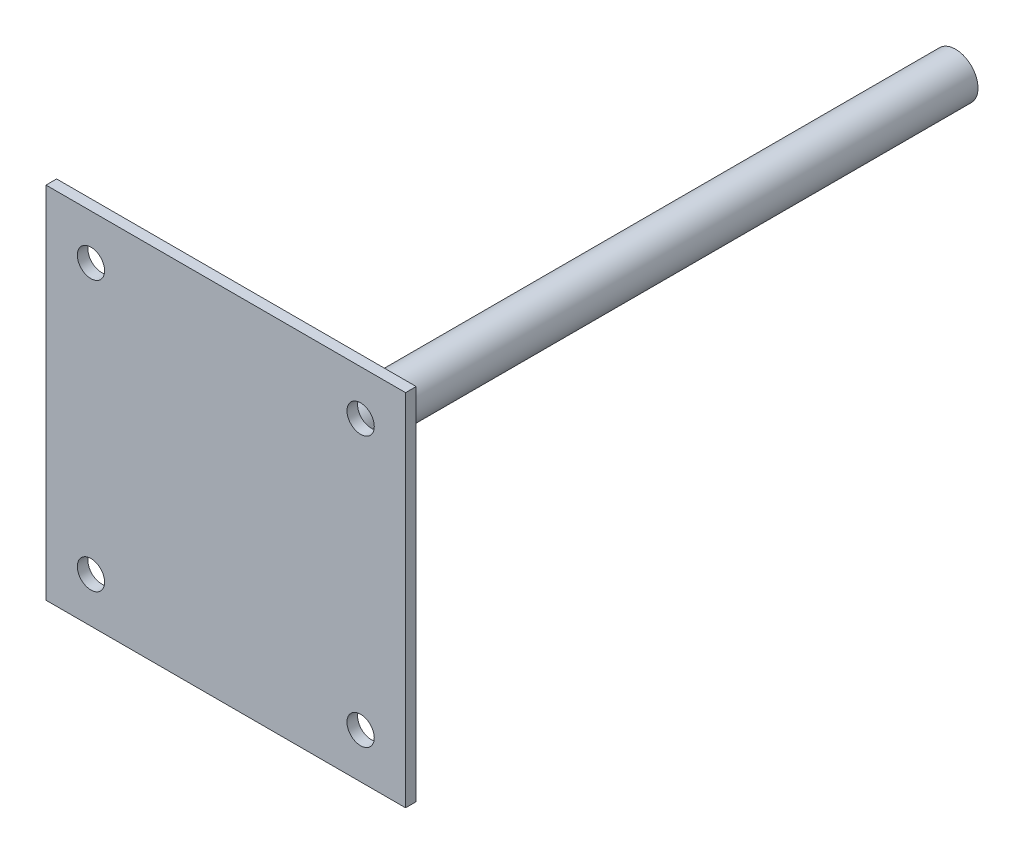
ISO-10303-21;
HEADER;
FILE_DESCRIPTION(('STEP AP214'),'2;1');
FILE_NAME('part.step','',(''),(''),'','','');
FILE_SCHEMA(('AUTOMOTIVE_DESIGN { 1 0 10303 214 1 1 1 1 }'));
ENDSEC;
DATA;
#1=APPLICATION_CONTEXT('core data for automotive mechanical design processes');
#2=APPLICATION_PROTOCOL_DEFINITION('international standard','automotive_design',2000,#1);
#3=PRODUCT_CONTEXT('',#1,'mechanical');
#4=PRODUCT('Part','Part','',(#3));
#5=PRODUCT_RELATED_PRODUCT_CATEGORY('part','',(#4));
#6=PRODUCT_DEFINITION_FORMATION('','',#4);
#7=PRODUCT_DEFINITION_CONTEXT('part definition',#1,'design');
#8=PRODUCT_DEFINITION('design','',#6,#7);
#9=PRODUCT_DEFINITION_SHAPE('','',#8);
#10=(LENGTH_UNIT() NAMED_UNIT(*) SI_UNIT(.MILLI.,.METRE.));
#11=(NAMED_UNIT(*) PLANE_ANGLE_UNIT() SI_UNIT($,.RADIAN.));
#12=(NAMED_UNIT(*) SI_UNIT($,.STERADIAN.) SOLID_ANGLE_UNIT());
#13=UNCERTAINTY_MEASURE_WITH_UNIT(LENGTH_MEASURE(1.E-05),#10,'distance_accuracy_value','');
#14=(GEOMETRIC_REPRESENTATION_CONTEXT(3) GLOBAL_UNCERTAINTY_ASSIGNED_CONTEXT((#13)) GLOBAL_UNIT_ASSIGNED_CONTEXT((#10,
#11,#12)) REPRESENTATION_CONTEXT('',''));
#15=CARTESIAN_POINT('',(0.,0.,0.));
#16=DIRECTION('',(0.,0.,1.));
#17=DIRECTION('',(1.,0.,0.));
#18=AXIS2_PLACEMENT_3D('',#15,#16,#17);
#19=CARTESIAN_POINT('',(50.8,0.,3.));
#20=DIRECTION('',(1.,0.,0.));
#21=DIRECTION('',(0.,0.,-1.));
#22=AXIS2_PLACEMENT_3D('',#19,#20,#21);
#23=PLANE('',#22);
#24=DIRECTION('',(0.,-1.,0.));
#25=VECTOR('',#24,1.);
#26=CARTESIAN_POINT('',(50.8,0.,0.));
#27=LINE('',#26,#25);
#28=CARTESIAN_POINT('',(50.8,50.8,0.));
#29=VERTEX_POINT('',#28);
#30=CARTESIAN_POINT('',(50.8,-50.8,0.));
#31=VERTEX_POINT('',#30);
#32=EDGE_CURVE('E135',#29,#31,#27,.T.);
#33=ORIENTED_EDGE('',*,*,#32,.F.);
#34=DIRECTION('',(0.,0.,-1.));
#35=VECTOR('',#34,1.);
#36=CARTESIAN_POINT('',(50.8,50.8,3.));
#37=LINE('',#36,#35);
#38=CARTESIAN_POINT('',(50.8,50.8,3.));
#39=VERTEX_POINT('',#38);
#40=EDGE_CURVE('E11',#39,#29,#37,.T.);
#41=ORIENTED_EDGE('',*,*,#40,.F.);
#42=DIRECTION('',(0.,-1.,0.));
#43=VECTOR('',#42,1.);
#44=CARTESIAN_POINT('',(50.8,0.,3.));
#45=LINE('',#44,#43);
#46=CARTESIAN_POINT('',(50.8,-50.8,3.));
#47=VERTEX_POINT('',#46);
#48=EDGE_CURVE('E108',#39,#47,#45,.T.);
#49=ORIENTED_EDGE('',*,*,#48,.T.);
#50=DIRECTION('',(0.,0.,-1.));
#51=VECTOR('',#50,1.);
#52=CARTESIAN_POINT('',(50.8,-50.8,3.));
#53=LINE('',#52,#51);
#54=EDGE_CURVE('E84',#47,#31,#53,.T.);
#55=ORIENTED_EDGE('',*,*,#54,.T.);
#56=EDGE_LOOP('',(#33,#41,#49,#55));
#57=FACE_BOUND('',#56,.T.);
#58=ADVANCED_FACE('F43',(#57),#23,.T.);
#59=CARTESIAN_POINT('',(0.,50.8,3.));
#60=DIRECTION('',(0.,1.,0.));
#61=DIRECTION('',(0.,0.,1.));
#62=AXIS2_PLACEMENT_3D('',#59,#60,#61);
#63=PLANE('',#62);
#64=DIRECTION('',(1.,0.,0.));
#65=VECTOR('',#64,1.);
#66=CARTESIAN_POINT('',(0.,50.8,0.));
#67=LINE('',#66,#65);
#68=CARTESIAN_POINT('',(-50.8,50.8,0.));
#69=VERTEX_POINT('',#68);
#70=EDGE_CURVE('E96',#69,#29,#67,.T.);
#71=ORIENTED_EDGE('',*,*,#70,.F.);
#72=DIRECTION('',(0.,0.,-1.));
#73=VECTOR('',#72,1.);
#74=CARTESIAN_POINT('',(-50.8,50.8,3.));
#75=LINE('',#74,#73);
#76=CARTESIAN_POINT('',(-50.8,50.8,3.));
#77=VERTEX_POINT('',#76);
#78=EDGE_CURVE('E53',#77,#69,#75,.T.);
#79=ORIENTED_EDGE('',*,*,#78,.F.);
#80=DIRECTION('',(1.,0.,0.));
#81=VECTOR('',#80,1.);
#82=CARTESIAN_POINT('',(0.,50.8,3.));
#83=LINE('',#82,#81);
#84=EDGE_CURVE('E94',#77,#39,#83,.T.);
#85=ORIENTED_EDGE('',*,*,#84,.T.);
#86=ORIENTED_EDGE('',*,*,#40,.T.);
#87=EDGE_LOOP('',(#71,#79,#85,#86));
#88=FACE_BOUND('',#87,.T.);
#89=ADVANCED_FACE('F92',(#88),#63,.T.);
#90=CARTESIAN_POINT('',(-50.8,0.,3.));
#91=DIRECTION('',(1.,0.,0.));
#92=DIRECTION('',(0.,0.,-1.));
#93=AXIS2_PLACEMENT_3D('',#90,#91,#92);
#94=PLANE('',#93);
#95=DIRECTION('',(0.,-1.,0.));
#96=VECTOR('',#95,1.);
#97=CARTESIAN_POINT('',(-50.8,0.,0.));
#98=LINE('',#97,#96);
#99=CARTESIAN_POINT('',(-50.8,-50.8,0.));
#100=VERTEX_POINT('',#99);
#101=EDGE_CURVE('E140',#69,#100,#98,.T.);
#102=ORIENTED_EDGE('',*,*,#101,.T.);
#103=DIRECTION('',(0.,0.,-1.));
#104=VECTOR('',#103,1.);
#105=CARTESIAN_POINT('',(-50.8,-50.8,3.));
#106=LINE('',#105,#104);
#107=CARTESIAN_POINT('',(-50.8,-50.8,3.));
#108=VERTEX_POINT('',#107);
#109=EDGE_CURVE('E100',#108,#100,#106,.T.);
#110=ORIENTED_EDGE('',*,*,#109,.F.);
#111=DIRECTION('',(0.,-1.,0.));
#112=VECTOR('',#111,1.);
#113=CARTESIAN_POINT('',(-50.8,0.,3.));
#114=LINE('',#113,#112);
#115=EDGE_CURVE('E102',#77,#108,#114,.T.);
#116=ORIENTED_EDGE('',*,*,#115,.F.);
#117=ORIENTED_EDGE('',*,*,#78,.T.);
#118=EDGE_LOOP('',(#102,#110,#116,#117));
#119=FACE_BOUND('',#118,.T.);
#120=ADVANCED_FACE('F103',(#119),#94,.F.);
#121=CARTESIAN_POINT('',(38.1,-38.1,3.));
#122=DIRECTION('',(0.,0.,-1.));
#123=DIRECTION('',(-1.,0.,0.));
#124=AXIS2_PLACEMENT_3D('',#121,#122,#123);
#125=CYLINDRICAL_SURFACE('',#124,3.85643376549096);
#126=CARTESIAN_POINT('',(38.1,-38.1,3.));
#127=DIRECTION('',(0.,0.,1.));
#128=DIRECTION('',(1.,0.,0.));
#129=AXIS2_PLACEMENT_3D('',#126,#127,#128);
#130=CIRCLE('',#129,3.85643376549096);
#131=CARTESIAN_POINT('',(41.9564337654909,-38.1,3.));
#132=VERTEX_POINT('',#131);
#133=EDGE_CURVE('E118',#132,#132,#130,.T.);
#134=ORIENTED_EDGE('',*,*,#133,.T.);
#135=EDGE_LOOP('',(#134));
#136=FACE_BOUND('',#135,.T.);
#137=CARTESIAN_POINT('',(38.1,-38.1,0.));
#138=DIRECTION('',(0.,0.,1.));
#139=DIRECTION('',(1.,0.,0.));
#140=AXIS2_PLACEMENT_3D('',#137,#138,#139);
#141=CIRCLE('',#140,3.85643376549096);
#142=CARTESIAN_POINT('',(41.9564337654909,-38.1,0.));
#143=VERTEX_POINT('',#142);
#144=EDGE_CURVE('E145',#143,#143,#141,.T.);
#145=ORIENTED_EDGE('',*,*,#144,.F.);
#146=EDGE_LOOP('',(#145));
#147=FACE_BOUND('',#146,.T.);
#148=ADVANCED_FACE('F177',(#136,#147),#125,.F.);
#149=CARTESIAN_POINT('',(0.,-50.8,3.));
#150=DIRECTION('',(0.,1.,0.));
#151=DIRECTION('',(0.,0.,1.));
#152=AXIS2_PLACEMENT_3D('',#149,#150,#151);
#153=PLANE('',#152);
#154=DIRECTION('',(1.,0.,0.));
#155=VECTOR('',#154,1.);
#156=CARTESIAN_POINT('',(0.,-50.8,0.));
#157=LINE('',#156,#155);
#158=EDGE_CURVE('E77',#100,#31,#157,.T.);
#159=ORIENTED_EDGE('',*,*,#158,.T.);
#160=ORIENTED_EDGE('',*,*,#54,.F.);
#161=DIRECTION('',(1.,0.,0.));
#162=VECTOR('',#161,1.);
#163=CARTESIAN_POINT('',(0.,-50.8,3.));
#164=LINE('',#163,#162);
#165=EDGE_CURVE('E61',#108,#47,#164,.T.);
#166=ORIENTED_EDGE('',*,*,#165,.F.);
#167=ORIENTED_EDGE('',*,*,#109,.T.);
#168=EDGE_LOOP('',(#159,#160,#166,#167));
#169=FACE_BOUND('',#168,.T.);
#170=ADVANCED_FACE('F158',(#169),#153,.F.);
#171=CARTESIAN_POINT('',(-38.1,38.1,3.));
#172=DIRECTION('',(0.,0.,-1.));
#173=DIRECTION('',(-1.,0.,0.));
#174=AXIS2_PLACEMENT_3D('',#171,#172,#173);
#175=CYLINDRICAL_SURFACE('',#174,3.85643376549096);
#176=CARTESIAN_POINT('',(-38.1,38.1,3.));
#177=DIRECTION('',(0.,0.,1.));
#178=DIRECTION('',(1.,0.,0.));
#179=AXIS2_PLACEMENT_3D('',#176,#177,#178);
#180=CIRCLE('',#179,3.85643376549096);
#181=CARTESIAN_POINT('',(-34.243566234509,38.1,3.));
#182=VERTEX_POINT('',#181);
#183=EDGE_CURVE('E112',#182,#182,#180,.T.);
#184=ORIENTED_EDGE('',*,*,#183,.T.);
#185=EDGE_LOOP('',(#184));
#186=FACE_BOUND('',#185,.T.);
#187=CARTESIAN_POINT('',(-38.1,38.1,0.));
#188=DIRECTION('',(0.,0.,1.));
#189=DIRECTION('',(1.,0.,0.));
#190=AXIS2_PLACEMENT_3D('',#187,#188,#189);
#191=CIRCLE('',#190,3.85643376549096);
#192=CARTESIAN_POINT('',(-34.243566234509,38.1,0.));
#193=VERTEX_POINT('',#192);
#194=EDGE_CURVE('E130',#193,#193,#191,.T.);
#195=ORIENTED_EDGE('',*,*,#194,.F.);
#196=EDGE_LOOP('',(#195));
#197=FACE_BOUND('',#196,.T.);
#198=ADVANCED_FACE('F168',(#186,#197),#175,.F.);
#199=CARTESIAN_POINT('',(38.1,38.1,3.));
#200=DIRECTION('',(0.,0.,-1.));
#201=DIRECTION('',(-1.,0.,0.));
#202=AXIS2_PLACEMENT_3D('',#199,#200,#201);
#203=CYLINDRICAL_SURFACE('',#202,3.85643376549096);
#204=CARTESIAN_POINT('',(38.1,38.1,3.));
#205=DIRECTION('',(0.,0.,1.));
#206=DIRECTION('',(1.,0.,0.));
#207=AXIS2_PLACEMENT_3D('',#204,#205,#206);
#208=CIRCLE('',#207,3.85643376549096);
#209=CARTESIAN_POINT('',(41.9564337654909,38.1,3.));
#210=VERTEX_POINT('',#209);
#211=EDGE_CURVE('E153',#210,#210,#208,.F.);
#212=ORIENTED_EDGE('',*,*,#211,.F.);
#213=EDGE_LOOP('',(#212));
#214=FACE_BOUND('',#213,.T.);
#215=CARTESIAN_POINT('',(38.1,38.1,0.));
#216=DIRECTION('',(0.,0.,1.));
#217=DIRECTION('',(1.,0.,0.));
#218=AXIS2_PLACEMENT_3D('',#215,#216,#217);
#219=CIRCLE('',#218,3.85643376549096);
#220=CARTESIAN_POINT('',(41.9564337654909,38.1,0.));
#221=VERTEX_POINT('',#220);
#222=EDGE_CURVE('E126',#221,#221,#219,.F.);
#223=ORIENTED_EDGE('',*,*,#222,.T.);
#224=EDGE_LOOP('',(#223));
#225=FACE_BOUND('',#224,.T.);
#226=ADVANCED_FACE('F45',(#214,#225),#203,.F.);
#227=CARTESIAN_POINT('',(-38.1,-38.1,3.));
#228=DIRECTION('',(0.,0.,-1.));
#229=DIRECTION('',(-1.,0.,0.));
#230=AXIS2_PLACEMENT_3D('',#227,#228,#229);
#231=CYLINDRICAL_SURFACE('',#230,3.85643376549096);
#232=CARTESIAN_POINT('',(-38.1,-38.1,3.));
#233=DIRECTION('',(0.,0.,1.));
#234=DIRECTION('',(1.,0.,0.));
#235=AXIS2_PLACEMENT_3D('',#232,#233,#234);
#236=CIRCLE('',#235,3.85643376549096);
#237=CARTESIAN_POINT('',(-34.243566234509,-38.1,3.));
#238=VERTEX_POINT('',#237);
#239=EDGE_CURVE('E122',#238,#238,#236,.F.);
#240=ORIENTED_EDGE('',*,*,#239,.F.);
#241=EDGE_LOOP('',(#240));
#242=FACE_BOUND('',#241,.T.);
#243=CARTESIAN_POINT('',(-38.1,-38.1,0.));
#244=DIRECTION('',(0.,0.,1.));
#245=DIRECTION('',(1.,0.,0.));
#246=AXIS2_PLACEMENT_3D('',#243,#244,#245);
#247=CIRCLE('',#246,3.85643376549096);
#248=CARTESIAN_POINT('',(-34.243566234509,-38.1,0.));
#249=VERTEX_POINT('',#248);
#250=EDGE_CURVE('E149',#249,#249,#247,.F.);
#251=ORIENTED_EDGE('',*,*,#250,.T.);
#252=EDGE_LOOP('',(#251));
#253=FACE_BOUND('',#252,.T.);
#254=ADVANCED_FACE('F175',(#242,#253),#231,.F.);
#255=CARTESIAN_POINT('',(0.,0.,3.));
#256=DIRECTION('',(0.,0.,1.));
#257=DIRECTION('',(1.,0.,0.));
#258=AXIS2_PLACEMENT_3D('',#255,#256,#257);
#259=PLANE('',#258);
#260=ORIENTED_EDGE('',*,*,#211,.T.);
#261=EDGE_LOOP('',(#260));
#262=FACE_BOUND('',#261,.T.);
#263=ORIENTED_EDGE('',*,*,#183,.F.);
#264=EDGE_LOOP('',(#263));
#265=FACE_BOUND('',#264,.T.);
#266=ORIENTED_EDGE('',*,*,#48,.F.);
#267=ORIENTED_EDGE('',*,*,#84,.F.);
#268=ORIENTED_EDGE('',*,*,#115,.T.);
#269=ORIENTED_EDGE('',*,*,#165,.T.);
#270=EDGE_LOOP('',(#266,#267,#268,#269));
#271=FACE_BOUND('',#270,.T.);
#272=ORIENTED_EDGE('',*,*,#133,.F.);
#273=EDGE_LOOP('',(#272));
#274=FACE_BOUND('',#273,.T.);
#275=ORIENTED_EDGE('',*,*,#239,.T.);
#276=EDGE_LOOP('',(#275));
#277=FACE_BOUND('',#276,.T.);
#278=ADVANCED_FACE('F106',(#262,#265,#271,#274,#277),#259,.T.);
#279=CARTESIAN_POINT('',(0.,0.,0.));
#280=DIRECTION('',(0.,0.,1.));
#281=DIRECTION('',(1.,0.,0.));
#282=AXIS2_PLACEMENT_3D('',#279,#280,#281);
#283=PLANE('',#282);
#284=CARTESIAN_POINT('',(0.,0.,0.));
#285=DIRECTION('',(0.,0.,1.));
#286=DIRECTION('',(1.,0.,0.));
#287=AXIS2_PLACEMENT_3D('',#284,#285,#286);
#288=CIRCLE('',#287,6.35);
#289=CARTESIAN_POINT('',(6.34999999999999,0.,0.));
#290=VERTEX_POINT('',#289);
#291=EDGE_CURVE('E302',#290,#290,#288,.T.);
#292=ORIENTED_EDGE('',*,*,#291,.T.);
#293=EDGE_LOOP('',(#292));
#294=FACE_BOUND('',#293,.T.);
#295=ORIENTED_EDGE('',*,*,#222,.F.);
#296=EDGE_LOOP('',(#295));
#297=FACE_BOUND('',#296,.T.);
#298=ORIENTED_EDGE('',*,*,#194,.T.);
#299=EDGE_LOOP('',(#298));
#300=FACE_BOUND('',#299,.T.);
#301=ORIENTED_EDGE('',*,*,#32,.T.);
#302=ORIENTED_EDGE('',*,*,#158,.F.);
#303=ORIENTED_EDGE('',*,*,#101,.F.);
#304=ORIENTED_EDGE('',*,*,#70,.T.);
#305=EDGE_LOOP('',(#301,#302,#303,#304));
#306=FACE_BOUND('',#305,.T.);
#307=ORIENTED_EDGE('',*,*,#144,.T.);
#308=EDGE_LOOP('',(#307));
#309=FACE_BOUND('',#308,.T.);
#310=ORIENTED_EDGE('',*,*,#250,.F.);
#311=EDGE_LOOP('',(#310));
#312=FACE_BOUND('',#311,.T.);
#313=ADVANCED_FACE('F159',(#294,#297,#300,#306,#309,#312),#283,.F.);
#314=CARTESIAN_POINT('',(0.,0.,-203.2));
#315=DIRECTION('',(0.,0.,1.));
#316=DIRECTION('',(1.,0.,0.));
#317=AXIS2_PLACEMENT_3D('',#314,#315,#316);
#318=CYLINDRICAL_SURFACE('',#317,6.35);
#319=CARTESIAN_POINT('',(0.,0.,-203.2));
#320=DIRECTION('',(0.,0.,1.));
#321=DIRECTION('',(1.,0.,0.));
#322=AXIS2_PLACEMENT_3D('',#319,#320,#321);
#323=CIRCLE('',#322,6.35);
#324=CARTESIAN_POINT('',(6.34999999999999,0.,-203.2));
#325=VERTEX_POINT('',#324);
#326=EDGE_CURVE('E131',#325,#325,#323,.T.);
#327=ORIENTED_EDGE('',*,*,#326,.T.);
#328=EDGE_LOOP('',(#327));
#329=FACE_BOUND('',#328,.T.);
#330=ORIENTED_EDGE('',*,*,#291,.F.);
#331=EDGE_LOOP('',(#330));
#332=FACE_BOUND('',#331,.T.);
#333=ADVANCED_FACE('F185',(#329,#332),#318,.T.);
#334=CARTESIAN_POINT('',(0.,0.,-203.2));
#335=DIRECTION('',(0.,0.,1.));
#336=DIRECTION('',(1.,0.,0.));
#337=AXIS2_PLACEMENT_3D('',#334,#335,#336);
#338=PLANE('',#337);
#339=ORIENTED_EDGE('',*,*,#326,.F.);
#340=EDGE_LOOP('',(#339));
#341=FACE_BOUND('',#340,.T.);
#342=ADVANCED_FACE('F192',(#341),#338,.F.);
#343=CLOSED_SHELL('',(#58,#89,#120,#148,#170,#198,#226,#254,#278,#313,#333,#342));
#344=MANIFOLD_SOLID_BREP('B2',#343);
#345=ADVANCED_BREP_SHAPE_REPRESENTATION('',(#18,#344),#14);
#346=SHAPE_DEFINITION_REPRESENTATION(#9,#345);
ENDSEC;
END-ISO-10303-21;
